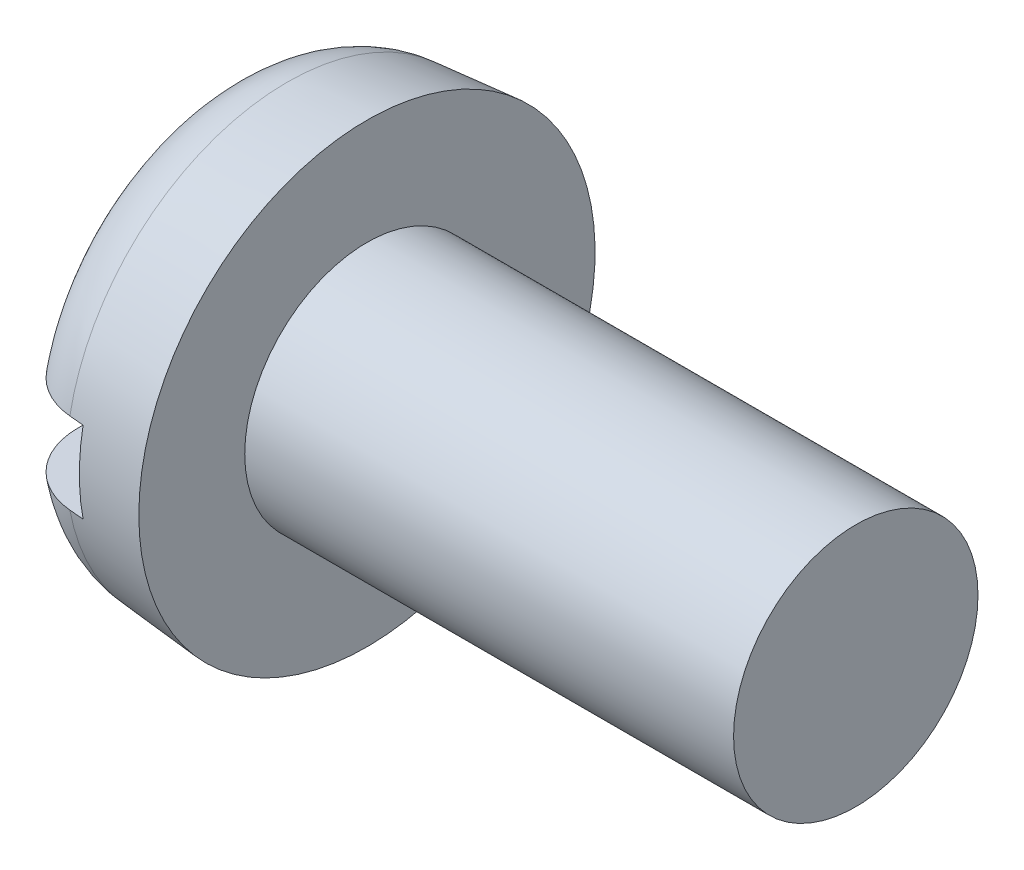
ISO-10303-21;
HEADER;
FILE_DESCRIPTION(('STEP AP214'),'2;1');
FILE_NAME('part.step','',(''),(''),'','','');
FILE_SCHEMA(('AUTOMOTIVE_DESIGN { 1 0 10303 214 1 1 1 1 }'));
ENDSEC;
DATA;
#1=APPLICATION_CONTEXT('core data for automotive mechanical design processes');
#2=APPLICATION_PROTOCOL_DEFINITION('international standard','automotive_design',2000,#1);
#3=PRODUCT_CONTEXT('',#1,'mechanical');
#4=PRODUCT('Part','Part','',(#3));
#5=PRODUCT_RELATED_PRODUCT_CATEGORY('part','',(#4));
#6=PRODUCT_DEFINITION_FORMATION('','',#4);
#7=PRODUCT_DEFINITION_CONTEXT('part definition',#1,'design');
#8=PRODUCT_DEFINITION('design','',#6,#7);
#9=PRODUCT_DEFINITION_SHAPE('','',#8);
#10=(LENGTH_UNIT() NAMED_UNIT(*) SI_UNIT(.MILLI.,.METRE.));
#11=(NAMED_UNIT(*) PLANE_ANGLE_UNIT() SI_UNIT($,.RADIAN.));
#12=(NAMED_UNIT(*) SI_UNIT($,.STERADIAN.) SOLID_ANGLE_UNIT());
#13=UNCERTAINTY_MEASURE_WITH_UNIT(LENGTH_MEASURE(1.E-05),#10,'distance_accuracy_value','');
#14=(GEOMETRIC_REPRESENTATION_CONTEXT(3) GLOBAL_UNCERTAINTY_ASSIGNED_CONTEXT((#13)) GLOBAL_UNIT_ASSIGNED_CONTEXT((#10,
#11,#12)) REPRESENTATION_CONTEXT('',''));
#15=CARTESIAN_POINT('',(0.,0.,0.));
#16=DIRECTION('',(0.,0.,1.));
#17=DIRECTION('',(1.,0.,0.));
#18=AXIS2_PLACEMENT_3D('',#15,#16,#17);
#19=CARTESIAN_POINT('',(0.821559831527111,0.,0.));
#20=DIRECTION('',(1.,0.,0.));
#21=DIRECTION('',(0.,0.,-1.));
#22=AXIS2_PLACEMENT_3D('',#19,#20,#21);
#23=CONICAL_SURFACE('',#22,2.71439757732023,0.0872664625997177);
#24=CARTESIAN_POINT('',(1.8,0.,0.));
#25=DIRECTION('',(-1.,0.,0.));
#26=DIRECTION('',(0.,0.,1.));
#27=AXIS2_PLACEMENT_3D('',#24,#25,#26);
#28=CIRCLE('',#27,2.8);
#29=CARTESIAN_POINT('',(1.8,0.,2.8));
#30=VERTEX_POINT('',#29);
#31=EDGE_CURVE('E104',#30,#30,#28,.T.);
#32=ORIENTED_EDGE('',*,*,#31,.T.);
#33=EDGE_LOOP('',(#32));
#34=FACE_BOUND('',#33,.T.);
#35=CARTESIAN_POINT('',(0.821559831527111,0.,0.));
#36=DIRECTION('',(-1.,0.,0.));
#37=DIRECTION('',(0.,0.,1.));
#38=AXIS2_PLACEMENT_3D('',#35,#36,#37);
#39=CIRCLE('',#38,2.71439757732023);
#40=CARTESIAN_POINT('',(0.821559831527131,-0.5,-2.6679494387568));
#41=VERTEX_POINT('',#40);
#42=CARTESIAN_POINT('',(0.821559831527111,-0.5,2.66794943875665));
#43=VERTEX_POINT('',#42);
#44=EDGE_CURVE('E111',#41,#43,#39,.T.);
#45=ORIENTED_EDGE('',*,*,#44,.F.);
#46=CARTESIAN_POINT('',(-4.12442087428723,-0.5,-2.22622217076508));
#47=CARTESIAN_POINT('',(-2.73083596809293,-0.5,-2.35116163400447));
#48=CARTESIAN_POINT('',(-1.33721073289136,-0.5,-2.47564974071432));
#49=CARTESIAN_POINT('',(0.322516888411918,-0.5,-2.62352009517032));
#50=CARTESIAN_POINT('',(0.588591528203756,-0.5,-2.64721365190135));
#51=CARTESIAN_POINT('',(2.51440730621907,-0.5,-2.81862532501024));
#52=CARTESIAN_POINT('',(4.17418519303496,-0.5,-2.96593083064264));
#53=CARTESIAN_POINT('',(5.83398131767659,-0.5,-3.11302949975196));
#54=B_SPLINE_CURVE_WITH_KNOTS('',3,(#46,#47,#48,#49,#50,#51,#52,#53),.UNSPECIFIED.,.F.,.F.,(4,2,
2,4),(0.,4.19752268049344,4.99890516464748,9.99781018983124),.UNSPECIFIED.);
#55=CARTESIAN_POINT('',(1.,-0.5,-2.68383112691559));
#56=VERTEX_POINT('',#55);
#57=EDGE_CURVE('E55',#41,#56,#54,.T.);
#58=ORIENTED_EDGE('',*,*,#57,.T.);
#59=CARTESIAN_POINT('',(1.,0.,0.));
#60=DIRECTION('',(1.,0.,0.));
#61=DIRECTION('',(0.,0.,-1.));
#62=AXIS2_PLACEMENT_3D('',#59,#60,#61);
#63=CIRCLE('',#62,2.73000906917926);
#64=CARTESIAN_POINT('',(1.,0.5,-2.68383112691559));
#65=VERTEX_POINT('',#64);
#66=EDGE_CURVE('E11',#65,#56,#63,.F.);
#67=ORIENTED_EDGE('',*,*,#66,.F.);
#68=CARTESIAN_POINT('',(-4.12442087428723,0.5,-2.22622217076508));
#69=CARTESIAN_POINT('',(-2.73083596809293,0.5,-2.35116163400447));
#70=CARTESIAN_POINT('',(-1.33721073289136,0.5,-2.47564974071432));
#71=CARTESIAN_POINT('',(0.322516888411918,0.5,-2.62352009517032));
#72=CARTESIAN_POINT('',(0.588591528203756,0.5,-2.64721365190135));
#73=CARTESIAN_POINT('',(2.51440730621907,0.5,-2.81862532501024));
#74=CARTESIAN_POINT('',(4.17418519303496,0.5,-2.96593083064264));
#75=CARTESIAN_POINT('',(5.83398131767659,0.5,-3.11302949975196));
#76=B_SPLINE_CURVE_WITH_KNOTS('',3,(#68,#69,#70,#71,#72,#73,#74,#75),.UNSPECIFIED.,.F.,.F.,(4,2,
2,4),(0.,4.19752268049344,4.99890516464748,9.99781018983124),.UNSPECIFIED.);
#77=CARTESIAN_POINT('',(0.821559831527131,0.5,-2.6679494387568));
#78=VERTEX_POINT('',#77);
#79=EDGE_CURVE('E144',#78,#65,#76,.T.);
#80=ORIENTED_EDGE('',*,*,#79,.F.);
#81=CARTESIAN_POINT('',(0.821559831527111,0.5,2.66794943875665));
#82=VERTEX_POINT('',#81);
#83=EDGE_CURVE('E100',#82,#78,#39,.T.);
#84=ORIENTED_EDGE('',*,*,#83,.F.);
#85=CARTESIAN_POINT('',(5.83398131767659,0.5,3.11302949975196));
#86=CARTESIAN_POINT('',(5.00408229964913,0.5,3.03949048597513));
#87=CARTESIAN_POINT('',(4.1741887401106,0.5,2.96588979968509));
#88=CARTESIAN_POINT('',(2.51441615810201,0.5,2.81852532777011));
#89=CARTESIAN_POINT('',(1.68453713563101,0.5,2.74476154215586));
#90=CARTESIAN_POINT('',(0.0247971144339573,0.5,2.59703110546268));
#91=CARTESIAN_POINT('',(-0.805063884291556,0.5,2.52306445437773));
#92=CARTESIAN_POINT('',(-2.46476188818933,0.5,2.37486187326903));
#93=CARTESIAN_POINT('',(-3.29459889336,0.5,2.30062594322747));
#94=CARTESIAN_POINT('',(-4.12442087428723,0.5,2.22622217076508));
#95=B_SPLINE_CURVE_WITH_KNOTS('',3,(#85,#86,#87,#88,#89,#90,#91,#92,#93,#94),.UNSPECIFIED.,.F.,
.F.,(4,2,2,2,4),(0.,2.49945260657952,4.99890504932049,7.49835756619491,9.99781024832811),.UNSPECIFIED.);
#96=CARTESIAN_POINT('',(1.,0.5,2.68383112691559));
#97=VERTEX_POINT('',#96);
#98=EDGE_CURVE('E47',#97,#82,#95,.T.);
#99=ORIENTED_EDGE('',*,*,#98,.F.);
#100=CARTESIAN_POINT('',(1.,-0.5,2.68383112691559));
#101=VERTEX_POINT('',#100);
#102=EDGE_CURVE('E36',#101,#97,#63,.F.);
#103=ORIENTED_EDGE('',*,*,#102,.F.);
#104=CARTESIAN_POINT('',(5.83398131767659,-0.5,3.11302949975196));
#105=CARTESIAN_POINT('',(5.00408229964913,-0.5,3.03949048597513));
#106=CARTESIAN_POINT('',(4.1741887401106,-0.5,2.96588979968509));
#107=CARTESIAN_POINT('',(2.51441615810201,-0.5,2.81852532777011));
#108=CARTESIAN_POINT('',(1.68453713563101,-0.5,2.74476154215586));
#109=CARTESIAN_POINT('',(0.0247971144339573,-0.5,2.59703110546268));
#110=CARTESIAN_POINT('',(-0.805063884291556,-0.5,2.52306445437773));
#111=CARTESIAN_POINT('',(-2.46476188818933,-0.5,2.37486187326903));
#112=CARTESIAN_POINT('',(-3.29459889336,-0.5,2.30062594322747));
#113=CARTESIAN_POINT('',(-4.12442087428723,-0.5,2.22622217076508));
#114=B_SPLINE_CURVE_WITH_KNOTS('',3,(#104,#105,#106,#107,#108,#109,#110,#111,#112,#113),
.UNSPECIFIED.,.F.,.F.,(4,2,2,2,4),(0.,2.49945260657952,4.99890504932049,7.49835756619491,
9.99781024832811),.UNSPECIFIED.);
#115=EDGE_CURVE('E151',#101,#43,#114,.T.);
#116=ORIENTED_EDGE('',*,*,#115,.T.);
#117=EDGE_LOOP('',(#45,#58,#67,#80,#84,#99,#103,#116));
#118=FACE_BOUND('',#117,.T.);
#119=ADVANCED_FACE('F32',(#34,#118),#23,.T.);
#120=CARTESIAN_POINT('',(0.,0.,0.));
#121=DIRECTION('',(-1.,0.,0.));
#122=DIRECTION('',(0.,0.,1.));
#123=AXIS2_PLACEMENT_3D('',#120,#121,#122);
#124=PLANE('',#123);
#125=CARTESIAN_POINT('',(0.,0.,0.));
#126=DIRECTION('',(-1.,0.,0.));
#127=DIRECTION('',(0.,0.,1.));
#128=AXIS2_PLACEMENT_3D('',#125,#126,#127);
#129=CIRCLE('',#128,1.81782234903766);
#130=CARTESIAN_POINT('',(0.,-0.5,-1.74770652360756));
#131=VERTEX_POINT('',#130);
#132=CARTESIAN_POINT('',(0.,-0.5,1.74770652360766));
#133=VERTEX_POINT('',#132);
#134=EDGE_CURVE('E105',#131,#133,#129,.T.);
#135=ORIENTED_EDGE('',*,*,#134,.T.);
#136=DIRECTION('',(0.,0.,1.));
#137=VECTOR('',#136,1.);
#138=CARTESIAN_POINT('',(0.,-0.5,-1.81782234903766));
#139=LINE('',#138,#137);
#140=EDGE_CURVE('E206',#131,#133,#139,.T.);
#141=ORIENTED_EDGE('',*,*,#140,.F.);
#142=EDGE_LOOP('',(#135,#141));
#143=FACE_BOUND('',#142,.T.);
#144=ADVANCED_FACE('F179',(#143),#124,.T.);
#145=CARTESIAN_POINT('',(0.9,0.,0.));
#146=DIRECTION('',(-1.,0.,0.));
#147=DIRECTION('',(0.,0.,1.));
#148=AXIS2_PLACEMENT_3D('',#145,#146,#147);
#149=TOROIDAL_SURFACE('',#148,1.81782234903766,0.9);
#150=ORIENTED_EDGE('',*,*,#134,.F.);
#151=CARTESIAN_POINT('',(0.334626026903701,-0.5,-2.46793360831049));
#152=CARTESIAN_POINT('',(0.373275648904086,-0.5,-2.49977130208659));
#153=CARTESIAN_POINT('',(0.414602352616745,-0.5,-2.52838421117688));
#154=CARTESIAN_POINT('',(0.501482653581103,-0.5,-2.57829292720234));
#155=CARTESIAN_POINT('',(0.547038320091168,-0.5,-2.59958512784551));
#156=CARTESIAN_POINT('',(0.641095951683961,-0.5,-2.63419701647043));
#157=CARTESIAN_POINT('',(0.689598385237159,-0.5,-2.64751543312539));
#158=CARTESIAN_POINT('',(0.788151814464883,-0.5,-2.66576358809586));
#159=CARTESIAN_POINT('',(0.838202640221332,-0.5,-2.67069424356938));
#160=CARTESIAN_POINT('',(0.938122790350139,-0.5,-2.67201489481239));
#161=CARTESIAN_POINT('',(0.987991462311356,-0.5,-2.66845471260746));
#162=CARTESIAN_POINT('',(1.08642068078859,-0.5,-2.65300579068591));
#163=CARTESIAN_POINT('',(1.13498123642244,-0.5,-2.64111710903621));
#164=CARTESIAN_POINT('',(1.22939259782638,-0.5,-2.6093811903211));
#165=CARTESIAN_POINT('',(1.27524506230553,-0.5,-2.58953888409779));
#166=CARTESIAN_POINT('',(1.36299979102268,-0.5,-2.54249087103575));
#167=CARTESIAN_POINT('',(1.40490198219518,-0.5,-2.51528502803477));
#168=CARTESIAN_POINT('',(1.48390827906179,-0.5,-2.45409196248148));
#169=CARTESIAN_POINT('',(1.52097536325995,-0.5,-2.42005696607452));
#170=CARTESIAN_POINT('',(1.58897450058502,-0.5,-2.34633281416614));
#171=CARTESIAN_POINT('',(1.61990622330414,-0.5,-2.30664335435241));
#172=CARTESIAN_POINT('',(1.67529968602995,-0.5,-2.22208664505847));
#173=CARTESIAN_POINT('',(1.6996521190693,-0.5,-2.17714783246274));
#174=CARTESIAN_POINT('',(1.74067416623053,-0.5,-2.08389516979523));
#175=CARTESIAN_POINT('',(1.75734303438384,-0.5,-2.03558099254607));
#176=CARTESIAN_POINT('',(1.78300298873171,-0.5,-1.93565537209906));
#177=CARTESIAN_POINT('',(1.79178952771252,-0.5,-1.88399147063275));
#178=CARTESIAN_POINT('',(1.80087955019692,-0.5,-1.77992679417679));
#179=CARTESIAN_POINT('',(1.80118168139773,-0.5,-1.72752590305235));
#180=CARTESIAN_POINT('',(1.79332687661337,-0.5,-1.62150229168849));
#181=CARTESIAN_POINT('',(1.78487071332093,-0.5,-1.56790180895203));
#182=CARTESIAN_POINT('',(1.75944402312706,-0.5,-1.46276517620418));
#183=CARTESIAN_POINT('',(1.74247216354575,-0.5,-1.41122935066878));
#184=CARTESIAN_POINT('',(1.69973001799174,-0.5,-1.30945300587343));
#185=CARTESIAN_POINT('',(1.67362852824404,-0.5,-1.25935148013265));
#186=CARTESIAN_POINT('',(1.61357159079207,-0.5,-1.16405892694269));
#187=CARTESIAN_POINT('',(1.57961116176646,-0.5,-1.11887104077686));
#188=CARTESIAN_POINT('',(1.50376329905658,-0.5,-1.0337112512591));
#189=CARTESIAN_POINT('',(1.46170411957052,-0.5,-0.993891803998863));
#190=CARTESIAN_POINT('',(1.37117703029393,-0.5,-0.922355348192727));
#191=CARTESIAN_POINT('',(1.32271533536457,-0.5,-0.890630568670401));
#192=CARTESIAN_POINT('',(1.2312046810326,-0.5,-0.842690969595324));
#193=CARTESIAN_POINT('',(1.18912546937037,-0.5,-0.824622784080812));
#194=CARTESIAN_POINT('',(1.10255861274784,-0.5,-0.795746649315501));
#195=CARTESIAN_POINT('',(1.0580739497846,-0.5,-0.784929923853792));
#196=CARTESIAN_POINT('',(0.967673998821343,-0.5,-0.77133828556953));
#197=CARTESIAN_POINT('',(0.921753341373889,-0.5,-0.768598465725972));
#198=CARTESIAN_POINT('',(0.830175370168714,-0.5,-0.771514809199295));
#199=CARTESIAN_POINT('',(0.784518094683075,-0.5,-0.777172163322448));
#200=CARTESIAN_POINT('',(0.697929857130244,-0.5,-0.795732365487629));
#201=CARTESIAN_POINT('',(0.656886976988524,-0.5,-0.808125586523618));
#202=CARTESIAN_POINT('',(0.577173146849336,-0.5,-0.839008986790702));
#203=CARTESIAN_POINT('',(0.538503116302415,-0.5,-0.857501511954047));
#204=CARTESIAN_POINT('',(0.460533080702894,-0.5,-0.901824293734246));
#205=CARTESIAN_POINT('',(0.421541782889522,-0.5,-0.928195541644686));
#206=CARTESIAN_POINT('',(0.347792925856961,-0.5,-0.986302994999605));
#207=CARTESIAN_POINT('',(0.313037391547055,-0.5,-1.01804174920804));
#208=CARTESIAN_POINT('',(0.243479646141384,-0.5,-1.09108875477486));
#209=CARTESIAN_POINT('',(0.209431960527425,-0.5,-1.13311808856621));
#210=CARTESIAN_POINT('',(0.148336369117296,-0.5,-1.2219977241085));
#211=CARTESIAN_POINT('',(0.121291240797289,-0.5,-1.26884992852459));
#212=CARTESIAN_POINT('',(0.0733587767475121,-0.5,-1.36947453336687));
#213=CARTESIAN_POINT('',(0.0529991909167098,-0.5,-1.42349983885821));
#214=CARTESIAN_POINT('',(0.0217806706073692,-0.5,-1.53423469167121));
#215=CARTESIAN_POINT('',(0.0109212949227816,-0.5,-1.59094411420892));
#216=CARTESIAN_POINT('',(-0.000680324341489833,-0.5,-1.70458275794277));
#217=CARTESIAN_POINT('',(-0.00156435311654909,-0.5,-1.76149736490422));
#218=CARTESIAN_POINT('',(0.00666921460971717,-0.5,-1.8746114299676));
#219=CARTESIAN_POINT('',(0.0157860229088503,-0.5,-1.93081094407548));
#220=CARTESIAN_POINT('',(0.0433527886832883,-0.5,-2.0384128726962));
#221=CARTESIAN_POINT('',(0.0614042634417451,-0.5,-2.08991750610009));
#222=CARTESIAN_POINT('',(0.106225018654683,-0.5,-2.18895619996254));
#223=CARTESIAN_POINT('',(0.132986525864045,-0.5,-2.2364937534783));
#224=CARTESIAN_POINT('',(0.187690670689828,-0.5,-2.31616353898221));
#225=CARTESIAN_POINT('',(0.214069785609247,-0.5,-2.34938052851721));
#226=CARTESIAN_POINT('',(0.271204082895664,-0.5,-2.41181052423278));
#227=CARTESIAN_POINT('',(0.301958818722134,-0.5,-2.44102393838941));
#228=CARTESIAN_POINT('',(0.334626026903701,-0.5,-2.46793360831049));
#229=B_SPLINE_CURVE_WITH_KNOTS('',3,(#151,#152,#153,#154,#155,#156,#157,#158,#159,#160,#161,
#162,#163,#164,#165,#166,#167,#168,#169,#170,#171,#172,#173,#174,#175,#176,#177,#178,#179,#180,
#181,#182,#183,#184,#185,#186,#187,#188,#189,#190,#191,#192,#193,#194,#195,#196,#197,#198,#199,
#200,#201,#202,#203,#204,#205,#206,#207,#208,#209,#210,#211,#212,#213,#214,#215,#216,#217,#218,
#219,#220,#221,#222,#223,#224,#225,#226,#227,#228),.UNSPECIFIED.,.T.,.F.,(4,2,2,2,2,2,2,2,2,2,2,
2,2,2,2,2,2,2,2,2,2,2,2,2,2,2,2,2,2,2,2,2,2,2,2,2,2,2,4),(0.,0.150073146732412,
0.300220116205011,0.450391018488457,0.600545499309663,0.74982108246734,0.899095624874882,
1.04827776744486,1.19746266879324,1.34773006839132,1.49800555814813,1.65064247079236,
1.80329419926387,1.95980138321463,2.11633351220655,2.27839576148222,2.44048338090795,
2.60919467169492,2.77801319301286,2.95091177341894,3.12364373927754,3.26045975797941,
3.39710989223543,3.53435288269838,3.6716153374989,3.79970208091242,3.92783814698728,
4.06851416099342,4.20925716363432,4.37083217035867,4.53247116593948,4.70483688203616,
4.87719459274841,5.04709934830923,5.2169907140229,5.37990813713711,5.54268056189257,
5.66953744876948,5.7963813989308),.UNSPECIFIED.);
#230=EDGE_CURVE('E195',#131,#41,#229,.T.);
#231=ORIENTED_EDGE('',*,*,#230,.T.);
#232=ORIENTED_EDGE('',*,*,#44,.T.);
#233=CARTESIAN_POINT('',(0.695761881797138,-0.5,0.797527849052158));
#234=CARTESIAN_POINT('',(0.73781333384874,-0.5,0.785965443795317));
#235=CARTESIAN_POINT('',(0.780830092945095,-0.5,0.777846393157726));
#236=CARTESIAN_POINT('',(0.867624970182326,-0.5,0.769116632051677));
#237=CARTESIAN_POINT('',(0.911402995349383,-0.5,0.768505011057419));
#238=CARTESIAN_POINT('',(0.998367386331298,-0.5,0.774836259550941));
#239=CARTESIAN_POINT('',(1.04155416404185,-0.5,0.781773567133159));
#240=CARTESIAN_POINT('',(1.12619698148315,-0.5,0.802657582389035));
#241=CARTESIAN_POINT('',(1.16765197468548,-0.5,0.816608463896431));
#242=CARTESIAN_POINT('',(1.2487772993255,-0.5,0.851032986716648));
#243=CARTESIAN_POINT('',(1.28839079814597,-0.5,0.871639252814936));
#244=CARTESIAN_POINT('',(1.3642158109992,-0.5,0.91834984762334));
#245=CARTESIAN_POINT('',(1.40042618433426,-0.5,0.944456010412648));
#246=CARTESIAN_POINT('',(1.47415344798094,-0.5,1.00568009841042));
#247=CARTESIAN_POINT('',(1.51103494611872,-0.5,1.0415643618778));
#248=CARTESIAN_POINT('',(1.57896848839971,-0.5,1.11848807208497));
#249=CARTESIAN_POINT('',(1.61001749168183,-0.5,1.15953018944387));
#250=CARTESIAN_POINT('',(1.66857474715472,-0.5,1.25032764741879));
#251=CARTESIAN_POINT('',(1.69536990541037,-0.5,1.30054537734181));
#252=CARTESIAN_POINT('',(1.74026833084286,-0.5,1.40473444523626));
#253=CARTESIAN_POINT('',(1.75837054500728,-0.5,1.4587062370467));
#254=CARTESIAN_POINT('',(1.78536712384459,-0.5,1.56958076375049));
#255=CARTESIAN_POINT('',(1.79415289443117,-0.5,1.62651012104794));
#256=CARTESIAN_POINT('',(1.80165605827819,-0.5,1.74103401619115));
#257=CARTESIAN_POINT('',(1.80037514023537,-0.5,1.79862844085268));
#258=CARTESIAN_POINT('',(1.78779666262416,-0.5,1.91060503473536));
#259=CARTESIAN_POINT('',(1.77686333607823,-0.5,1.96502801810785));
#260=CARTESIAN_POINT('',(1.7456222557847,-0.5,2.07111653593492));
#261=CARTESIAN_POINT('',(1.72531664905969,-0.5,2.12278269890549));
#262=CARTESIAN_POINT('',(1.67682820611129,-0.5,2.21965573667746));
#263=CARTESIAN_POINT('',(1.64899919485797,-0.5,2.2650398219442));
#264=CARTESIAN_POINT('',(1.58588988798268,-0.5,2.3502939816606));
#265=CARTESIAN_POINT('',(1.55061096298909,-0.5,2.390165068157));
#266=CARTESIAN_POINT('',(1.47479237069204,-0.5,2.46198398594914));
#267=CARTESIAN_POINT('',(1.43444725966653,-0.5,2.49413733666256));
#268=CARTESIAN_POINT('',(1.34884189557066,-0.5,2.55105217341873));
#269=CARTESIAN_POINT('',(1.30358223313984,-0.5,2.57581454638437));
#270=CARTESIAN_POINT('',(1.21039836188347,-0.5,2.61675696488751));
#271=CARTESIAN_POINT('',(1.16254402736379,-0.5,2.63309616067642));
#272=CARTESIAN_POINT('',(1.06475678121195,-0.5,2.65741537035073));
#273=CARTESIAN_POINT('',(1.01482401135433,-0.5,2.66539595342669));
#274=CARTESIAN_POINT('',(0.914844586329804,-0.5,2.67271373983095));
#275=CARTESIAN_POINT('',(0.864804319491045,-0.5,2.67213851235753));
#276=CARTESIAN_POINT('',(0.765535235130208,-0.5,2.66257605972729));
#277=CARTESIAN_POINT('',(0.716306396598705,-0.5,2.65358905271672));
#278=CARTESIAN_POINT('',(0.620155421664219,-0.5,2.62750280668606));
#279=CARTESIAN_POINT('',(0.573228849594445,-0.5,2.61041990216113));
#280=CARTESIAN_POINT('',(0.482887005980971,-0.5,2.56866222001781));
#281=CARTESIAN_POINT('',(0.439471776038166,-0.5,2.54398735246969));
#282=CARTESIAN_POINT('',(0.357098481555818,-0.5,2.48761345136412));
#283=CARTESIAN_POINT('',(0.318167950329371,-0.5,2.45587420734086));
#284=CARTESIAN_POINT('',(0.246098316731351,-0.5,2.3863929407266));
#285=CARTESIAN_POINT('',(0.212959491058588,-0.5,2.34865063150351));
#286=CARTESIAN_POINT('',(0.152890402271188,-0.5,2.26768100750256));
#287=CARTESIAN_POINT('',(0.126054624241496,-0.5,2.22438363750579));
#288=CARTESIAN_POINT('',(0.0798449976638117,-0.5,2.13397936701696));
#289=CARTESIAN_POINT('',(0.0604718141945122,-0.5,2.08687212743555));
#290=CARTESIAN_POINT('',(0.0292230605581626,-0.5,1.98901420270965));
#291=CARTESIAN_POINT('',(0.017534312540283,-0.5,1.93820392357391));
#292=CARTESIAN_POINT('',(0.00255513324705669,-0.5,1.83536425588533));
#293=CARTESIAN_POINT('',(-0.000734037465548531,-0.5,1.78333468553019));
#294=CARTESIAN_POINT('',(0.0010370634327739,-0.5,1.67766921750121));
#295=CARTESIAN_POINT('',(0.00638194385347503,-0.5,1.62403816473432));
#296=CARTESIAN_POINT('',(0.0256344990653406,-0.5,1.51834257802767));
#297=CARTESIAN_POINT('',(0.0395432868496452,-0.5,1.46627824862699));
#298=CARTESIAN_POINT('',(0.0761438693586416,-0.5,1.36294170833287));
#299=CARTESIAN_POINT('',(0.099169873239112,-0.5,1.31178783646753));
#300=CARTESIAN_POINT('',(0.153241438265485,-0.5,1.21387084507843));
#301=CARTESIAN_POINT('',(0.184292522118294,-0.5,1.16711077962595));
#302=CARTESIAN_POINT('',(0.254676869891252,-0.5,1.07792735315924));
#303=CARTESIAN_POINT('',(0.294235133972406,-0.5,1.03568120276964));
#304=CARTESIAN_POINT('',(0.38008225117084,-0.5,0.958725906333809));
#305=CARTESIAN_POINT('',(0.426362289377703,-0.5,0.924007035435211));
#306=CARTESIAN_POINT('',(0.509753246762668,-0.5,0.872889782282794));
#307=CARTESIAN_POINT('',(0.545424857916313,-0.5,0.854123355683078));
#308=CARTESIAN_POINT('',(0.619045756221319,-0.5,0.821773859571963));
#309=CARTESIAN_POINT('',(0.656993589566124,-0.5,0.808187521525312));
#310=CARTESIAN_POINT('',(0.695761881797138,-0.5,0.797527849052158));
#311=B_SPLINE_CURVE_WITH_KNOTS('',3,(#233,#234,#235,#236,#237,#238,#239,#240,#241,#242,#243,
#244,#245,#246,#247,#248,#249,#250,#251,#252,#253,#254,#255,#256,#257,#258,#259,#260,#261,#262,
#263,#264,#265,#266,#267,#268,#269,#270,#271,#272,#273,#274,#275,#276,#277,#278,#279,#280,#281,
#282,#283,#284,#285,#286,#287,#288,#289,#290,#291,#292,#293,#294,#295,#296,#297,#298,#299,#300,
#301,#302,#303,#304,#305,#306,#307,#308,#309,#310),.UNSPECIFIED.,.T.,.F.,(4,2,2,2,2,2,2,2,2,2,2,
2,2,2,2,2,2,2,2,2,2,2,2,2,2,2,2,2,2,2,2,2,2,2,2,2,2,2,4),(0.,0.130699420105768,
0.261382988398612,0.391970336701852,0.522635490733216,0.656084239625503,0.789577561009042,
0.943325755614514,1.09715388807325,1.26711867734695,1.43710404997135,1.60904972581368,
1.78096655821838,1.94666081700181,2.11231713700401,2.27123844707334,2.43013054437774,
2.58414890255061,2.73814877096699,2.88912114896077,3.04008324562633,3.1895013095358,
3.3389154986305,3.48802950088912,3.63714526952866,3.78713255803254,3.93712701022352,
4.08924385843726,4.24137426041967,4.39707844937152,4.55280600418579,4.71377244073828,
4.87475980142717,5.04229473012568,5.20994526159696,5.38274273193649,5.55531560877505,
5.67588689888493,5.79638198444979),.UNSPECIFIED.);
#312=EDGE_CURVE('E101',#43,#133,#311,.T.);
#313=ORIENTED_EDGE('',*,*,#312,.T.);
#314=EDGE_LOOP('',(#150,#231,#232,#313));
#315=FACE_BOUND('',#314,.T.);
#316=ADVANCED_FACE('F173',(#315),#149,.T.);
#317=CARTESIAN_POINT('',(1.8,2.8,0.));
#318=DIRECTION('',(1.,0.,0.));
#319=DIRECTION('',(0.,0.,-1.));
#320=AXIS2_PLACEMENT_3D('',#317,#318,#319);
#321=PLANE('',#320);
#322=ORIENTED_EDGE('',*,*,#31,.F.);
#323=EDGE_LOOP('',(#322));
#324=FACE_BOUND('',#323,.T.);
#325=CARTESIAN_POINT('',(1.8,0.,0.));
#326=DIRECTION('',(1.,0.,0.));
#327=DIRECTION('',(0.,0.,-1.));
#328=AXIS2_PLACEMENT_3D('',#325,#326,#327);
#329=CIRCLE('',#328,1.5);
#330=CARTESIAN_POINT('',(1.8,0.,-1.5));
#331=VERTEX_POINT('',#330);
#332=EDGE_CURVE('E163',#331,#331,#329,.T.);
#333=ORIENTED_EDGE('',*,*,#332,.F.);
#334=EDGE_LOOP('',(#333));
#335=FACE_BOUND('',#334,.T.);
#336=ADVANCED_FACE('F171',(#324,#335),#321,.T.);
#337=DIRECTION('',(0.,0.,1.));
#338=VECTOR('',#337,1.);
#339=CARTESIAN_POINT('',(0.,0.5,-1.81782234903766));
#340=LINE('',#339,#338);
#341=CARTESIAN_POINT('',(0.,0.5,-1.74770652360756));
#342=VERTEX_POINT('',#341);
#343=CARTESIAN_POINT('',(0.,0.5,1.74770652360766));
#344=VERTEX_POINT('',#343);
#345=EDGE_CURVE('E84',#342,#344,#340,.T.);
#346=ORIENTED_EDGE('',*,*,#345,.T.);
#347=EDGE_CURVE('E98',#344,#342,#129,.T.);
#348=ORIENTED_EDGE('',*,*,#347,.T.);
#349=EDGE_LOOP('',(#346,#348));
#350=FACE_BOUND('',#349,.T.);
#351=ADVANCED_FACE('F103',(#350),#124,.T.);
#352=CARTESIAN_POINT('',(0.334626026903701,0.5,-2.46793360831049));
#353=CARTESIAN_POINT('',(0.373275648904086,0.5,-2.49977130208659));
#354=CARTESIAN_POINT('',(0.414602352616745,0.5,-2.52838421117688));
#355=CARTESIAN_POINT('',(0.501482653581103,0.5,-2.57829292720234));
#356=CARTESIAN_POINT('',(0.547038320091168,0.5,-2.59958512784551));
#357=CARTESIAN_POINT('',(0.641095951683961,0.5,-2.63419701647043));
#358=CARTESIAN_POINT('',(0.689598385237159,0.5,-2.64751543312539));
#359=CARTESIAN_POINT('',(0.788151814464883,0.5,-2.66576358809586));
#360=CARTESIAN_POINT('',(0.838202640221332,0.5,-2.67069424356938));
#361=CARTESIAN_POINT('',(0.938122790350139,0.5,-2.67201489481239));
#362=CARTESIAN_POINT('',(0.987991462311356,0.5,-2.66845471260746));
#363=CARTESIAN_POINT('',(1.08642068078859,0.5,-2.65300579068591));
#364=CARTESIAN_POINT('',(1.13498123642244,0.5,-2.64111710903621));
#365=CARTESIAN_POINT('',(1.22939259782638,0.5,-2.6093811903211));
#366=CARTESIAN_POINT('',(1.27524506230553,0.5,-2.58953888409779));
#367=CARTESIAN_POINT('',(1.36299979102268,0.5,-2.54249087103575));
#368=CARTESIAN_POINT('',(1.40490198219518,0.5,-2.51528502803477));
#369=CARTESIAN_POINT('',(1.48390827906179,0.5,-2.45409196248148));
#370=CARTESIAN_POINT('',(1.52097536325995,0.5,-2.42005696607452));
#371=CARTESIAN_POINT('',(1.58897450058502,0.5,-2.34633281416614));
#372=CARTESIAN_POINT('',(1.61990622330414,0.5,-2.30664335435241));
#373=CARTESIAN_POINT('',(1.67529968602995,0.5,-2.22208664505847));
#374=CARTESIAN_POINT('',(1.6996521190693,0.5,-2.17714783246274));
#375=CARTESIAN_POINT('',(1.74067416623053,0.5,-2.08389516979523));
#376=CARTESIAN_POINT('',(1.75734303438384,0.5,-2.03558099254607));
#377=CARTESIAN_POINT('',(1.78300298873171,0.5,-1.93565537209906));
#378=CARTESIAN_POINT('',(1.79178952771252,0.5,-1.88399147063275));
#379=CARTESIAN_POINT('',(1.80087955019692,0.5,-1.77992679417679));
#380=CARTESIAN_POINT('',(1.80118168139773,0.5,-1.72752590305235));
#381=CARTESIAN_POINT('',(1.79332687661337,0.5,-1.62150229168849));
#382=CARTESIAN_POINT('',(1.78487071332093,0.5,-1.56790180895203));
#383=CARTESIAN_POINT('',(1.75944402312706,0.5,-1.46276517620418));
#384=CARTESIAN_POINT('',(1.74247216354575,0.5,-1.41122935066878));
#385=CARTESIAN_POINT('',(1.69973001799174,0.5,-1.30945300587343));
#386=CARTESIAN_POINT('',(1.67362852824404,0.5,-1.25935148013265));
#387=CARTESIAN_POINT('',(1.61357159079207,0.5,-1.16405892694269));
#388=CARTESIAN_POINT('',(1.57961116176646,0.5,-1.11887104077686));
#389=CARTESIAN_POINT('',(1.50376329905658,0.5,-1.0337112512591));
#390=CARTESIAN_POINT('',(1.46170411957052,0.5,-0.993891803998863));
#391=CARTESIAN_POINT('',(1.37117703029393,0.5,-0.922355348192727));
#392=CARTESIAN_POINT('',(1.32271533536457,0.5,-0.890630568670401));
#393=CARTESIAN_POINT('',(1.2312046810326,0.5,-0.842690969595324));
#394=CARTESIAN_POINT('',(1.18912546937037,0.5,-0.824622784080812));
#395=CARTESIAN_POINT('',(1.10255861274784,0.5,-0.795746649315501));
#396=CARTESIAN_POINT('',(1.0580739497846,0.5,-0.784929923853792));
#397=CARTESIAN_POINT('',(0.967673998821343,0.5,-0.77133828556953));
#398=CARTESIAN_POINT('',(0.921753341373889,0.5,-0.768598465725972));
#399=CARTESIAN_POINT('',(0.830175370168714,0.5,-0.771514809199295));
#400=CARTESIAN_POINT('',(0.784518094683075,0.5,-0.777172163322448));
#401=CARTESIAN_POINT('',(0.697929857130244,0.5,-0.795732365487629));
#402=CARTESIAN_POINT('',(0.656886976988524,0.5,-0.808125586523618));
#403=CARTESIAN_POINT('',(0.577173146849336,0.5,-0.839008986790702));
#404=CARTESIAN_POINT('',(0.538503116302415,0.5,-0.857501511954047));
#405=CARTESIAN_POINT('',(0.460533080702894,0.5,-0.901824293734246));
#406=CARTESIAN_POINT('',(0.421541782889522,0.5,-0.928195541644686));
#407=CARTESIAN_POINT('',(0.347792925856961,0.5,-0.986302994999605));
#408=CARTESIAN_POINT('',(0.313037391547055,0.5,-1.01804174920804));
#409=CARTESIAN_POINT('',(0.243479646141384,0.5,-1.09108875477486));
#410=CARTESIAN_POINT('',(0.209431960527425,0.5,-1.13311808856621));
#411=CARTESIAN_POINT('',(0.148336369117296,0.5,-1.2219977241085));
#412=CARTESIAN_POINT('',(0.121291240797289,0.5,-1.26884992852459));
#413=CARTESIAN_POINT('',(0.0733587767475121,0.5,-1.36947453336687));
#414=CARTESIAN_POINT('',(0.0529991909167098,0.5,-1.42349983885821));
#415=CARTESIAN_POINT('',(0.0217806706073692,0.5,-1.53423469167121));
#416=CARTESIAN_POINT('',(0.0109212949227816,0.5,-1.59094411420892));
#417=CARTESIAN_POINT('',(-0.000680324341489833,0.5,-1.70458275794277));
#418=CARTESIAN_POINT('',(-0.00156435311654909,0.5,-1.76149736490422));
#419=CARTESIAN_POINT('',(0.00666921460971717,0.5,-1.8746114299676));
#420=CARTESIAN_POINT('',(0.0157860229088503,0.5,-1.93081094407548));
#421=CARTESIAN_POINT('',(0.0433527886832883,0.5,-2.0384128726962));
#422=CARTESIAN_POINT('',(0.0614042634417451,0.5,-2.08991750610009));
#423=CARTESIAN_POINT('',(0.106225018654683,0.5,-2.18895619996254));
#424=CARTESIAN_POINT('',(0.132986525864045,0.5,-2.2364937534783));
#425=CARTESIAN_POINT('',(0.187690670689828,0.5,-2.31616353898221));
#426=CARTESIAN_POINT('',(0.214069785609247,0.5,-2.34938052851721));
#427=CARTESIAN_POINT('',(0.271204082895664,0.5,-2.41181052423278));
#428=CARTESIAN_POINT('',(0.301958818722134,0.5,-2.44102393838941));
#429=CARTESIAN_POINT('',(0.334626026903701,0.5,-2.46793360831049));
#430=B_SPLINE_CURVE_WITH_KNOTS('',3,(#352,#353,#354,#355,#356,#357,#358,#359,#360,#361,#362,
#363,#364,#365,#366,#367,#368,#369,#370,#371,#372,#373,#374,#375,#376,#377,#378,#379,#380,#381,
#382,#383,#384,#385,#386,#387,#388,#389,#390,#391,#392,#393,#394,#395,#396,#397,#398,#399,#400,
#401,#402,#403,#404,#405,#406,#407,#408,#409,#410,#411,#412,#413,#414,#415,#416,#417,#418,#419,
#420,#421,#422,#423,#424,#425,#426,#427,#428,#429),.UNSPECIFIED.,.T.,.F.,(4,2,2,2,2,2,2,2,2,2,2,
2,2,2,2,2,2,2,2,2,2,2,2,2,2,2,2,2,2,2,2,2,2,2,2,2,2,2,4),(0.,0.150073146732412,
0.300220116205011,0.450391018488457,0.600545499309663,0.74982108246734,0.899095624874882,
1.04827776744486,1.19746266879324,1.34773006839132,1.49800555814813,1.65064247079236,
1.80329419926387,1.95980138321463,2.11633351220655,2.27839576148222,2.44048338090795,
2.60919467169492,2.77801319301286,2.95091177341894,3.12364373927754,3.26045975797941,
3.39710989223543,3.53435288269838,3.6716153374989,3.79970208091242,3.92783814698728,
4.06851416099342,4.20925716363432,4.37083217035867,4.53247116593948,4.70483688203616,
4.87719459274841,5.04709934830923,5.2169907140229,5.37990813713711,5.54268056189257,
5.66953744876948,5.7963813989308),.UNSPECIFIED.);
#431=EDGE_CURVE('E87',#342,#78,#430,.T.);
#432=ORIENTED_EDGE('',*,*,#431,.F.);
#433=ORIENTED_EDGE('',*,*,#347,.F.);
#434=CARTESIAN_POINT('',(0.695761881797138,0.5,0.797527849052158));
#435=CARTESIAN_POINT('',(0.73781333384874,0.5,0.785965443795317));
#436=CARTESIAN_POINT('',(0.780830092945095,0.5,0.777846393157726));
#437=CARTESIAN_POINT('',(0.867624970182326,0.5,0.769116632051677));
#438=CARTESIAN_POINT('',(0.911402995349383,0.5,0.768505011057419));
#439=CARTESIAN_POINT('',(0.998367386331298,0.5,0.774836259550941));
#440=CARTESIAN_POINT('',(1.04155416404185,0.5,0.781773567133159));
#441=CARTESIAN_POINT('',(1.12619698148315,0.5,0.802657582389035));
#442=CARTESIAN_POINT('',(1.16765197468548,0.5,0.816608463896431));
#443=CARTESIAN_POINT('',(1.2487772993255,0.5,0.851032986716648));
#444=CARTESIAN_POINT('',(1.28839079814597,0.5,0.871639252814936));
#445=CARTESIAN_POINT('',(1.3642158109992,0.5,0.91834984762334));
#446=CARTESIAN_POINT('',(1.40042618433426,0.5,0.944456010412648));
#447=CARTESIAN_POINT('',(1.47415344798094,0.5,1.00568009841042));
#448=CARTESIAN_POINT('',(1.51103494611872,0.5,1.0415643618778));
#449=CARTESIAN_POINT('',(1.57896848839971,0.5,1.11848807208497));
#450=CARTESIAN_POINT('',(1.61001749168183,0.5,1.15953018944387));
#451=CARTESIAN_POINT('',(1.66857474715472,0.5,1.25032764741879));
#452=CARTESIAN_POINT('',(1.69536990541037,0.5,1.30054537734181));
#453=CARTESIAN_POINT('',(1.74026833084286,0.5,1.40473444523626));
#454=CARTESIAN_POINT('',(1.75837054500728,0.5,1.4587062370467));
#455=CARTESIAN_POINT('',(1.78536712384459,0.5,1.56958076375049));
#456=CARTESIAN_POINT('',(1.79415289443117,0.5,1.62651012104794));
#457=CARTESIAN_POINT('',(1.80165605827819,0.5,1.74103401619115));
#458=CARTESIAN_POINT('',(1.80037514023537,0.5,1.79862844085268));
#459=CARTESIAN_POINT('',(1.78779666262416,0.5,1.91060503473536));
#460=CARTESIAN_POINT('',(1.77686333607823,0.5,1.96502801810785));
#461=CARTESIAN_POINT('',(1.7456222557847,0.5,2.07111653593492));
#462=CARTESIAN_POINT('',(1.72531664905969,0.5,2.12278269890549));
#463=CARTESIAN_POINT('',(1.67682820611129,0.5,2.21965573667746));
#464=CARTESIAN_POINT('',(1.64899919485797,0.5,2.2650398219442));
#465=CARTESIAN_POINT('',(1.58588988798268,0.5,2.3502939816606));
#466=CARTESIAN_POINT('',(1.55061096298909,0.5,2.390165068157));
#467=CARTESIAN_POINT('',(1.47479237069204,0.5,2.46198398594914));
#468=CARTESIAN_POINT('',(1.43444725966653,0.5,2.49413733666256));
#469=CARTESIAN_POINT('',(1.34884189557066,0.5,2.55105217341873));
#470=CARTESIAN_POINT('',(1.30358223313984,0.5,2.57581454638437));
#471=CARTESIAN_POINT('',(1.21039836188347,0.5,2.61675696488751));
#472=CARTESIAN_POINT('',(1.16254402736379,0.5,2.63309616067642));
#473=CARTESIAN_POINT('',(1.06475678121195,0.5,2.65741537035073));
#474=CARTESIAN_POINT('',(1.01482401135433,0.5,2.66539595342669));
#475=CARTESIAN_POINT('',(0.914844586329804,0.5,2.67271373983095));
#476=CARTESIAN_POINT('',(0.864804319491045,0.5,2.67213851235753));
#477=CARTESIAN_POINT('',(0.765535235130208,0.5,2.66257605972729));
#478=CARTESIAN_POINT('',(0.716306396598705,0.5,2.65358905271672));
#479=CARTESIAN_POINT('',(0.620155421664219,0.5,2.62750280668606));
#480=CARTESIAN_POINT('',(0.573228849594445,0.5,2.61041990216113));
#481=CARTESIAN_POINT('',(0.482887005980971,0.5,2.56866222001781));
#482=CARTESIAN_POINT('',(0.439471776038166,0.5,2.54398735246969));
#483=CARTESIAN_POINT('',(0.357098481555818,0.5,2.48761345136412));
#484=CARTESIAN_POINT('',(0.318167950329371,0.5,2.45587420734086));
#485=CARTESIAN_POINT('',(0.246098316731351,0.5,2.3863929407266));
#486=CARTESIAN_POINT('',(0.212959491058588,0.5,2.34865063150351));
#487=CARTESIAN_POINT('',(0.152890402271188,0.5,2.26768100750256));
#488=CARTESIAN_POINT('',(0.126054624241496,0.5,2.22438363750579));
#489=CARTESIAN_POINT('',(0.0798449976638117,0.5,2.13397936701696));
#490=CARTESIAN_POINT('',(0.0604718141945122,0.5,2.08687212743555));
#491=CARTESIAN_POINT('',(0.0292230605581626,0.5,1.98901420270965));
#492=CARTESIAN_POINT('',(0.017534312540283,0.5,1.93820392357391));
#493=CARTESIAN_POINT('',(0.00255513324705669,0.5,1.83536425588533));
#494=CARTESIAN_POINT('',(-0.000734037465548531,0.5,1.78333468553019));
#495=CARTESIAN_POINT('',(0.0010370634327739,0.5,1.67766921750121));
#496=CARTESIAN_POINT('',(0.00638194385347503,0.5,1.62403816473432));
#497=CARTESIAN_POINT('',(0.0256344990653406,0.5,1.51834257802767));
#498=CARTESIAN_POINT('',(0.0395432868496452,0.5,1.46627824862699));
#499=CARTESIAN_POINT('',(0.0761438693586416,0.5,1.36294170833287));
#500=CARTESIAN_POINT('',(0.099169873239112,0.5,1.31178783646753));
#501=CARTESIAN_POINT('',(0.153241438265485,0.5,1.21387084507843));
#502=CARTESIAN_POINT('',(0.184292522118294,0.5,1.16711077962595));
#503=CARTESIAN_POINT('',(0.254676869891252,0.5,1.07792735315924));
#504=CARTESIAN_POINT('',(0.294235133972406,0.5,1.03568120276964));
#505=CARTESIAN_POINT('',(0.38008225117084,0.5,0.958725906333809));
#506=CARTESIAN_POINT('',(0.426362289377703,0.5,0.924007035435211));
#507=CARTESIAN_POINT('',(0.509753246762668,0.5,0.872889782282794));
#508=CARTESIAN_POINT('',(0.545424857916313,0.5,0.854123355683078));
#509=CARTESIAN_POINT('',(0.619045756221319,0.5,0.821773859571963));
#510=CARTESIAN_POINT('',(0.656993589566124,0.5,0.808187521525312));
#511=CARTESIAN_POINT('',(0.695761881797138,0.5,0.797527849052158));
#512=B_SPLINE_CURVE_WITH_KNOTS('',3,(#434,#435,#436,#437,#438,#439,#440,#441,#442,#443,#444,
#445,#446,#447,#448,#449,#450,#451,#452,#453,#454,#455,#456,#457,#458,#459,#460,#461,#462,#463,
#464,#465,#466,#467,#468,#469,#470,#471,#472,#473,#474,#475,#476,#477,#478,#479,#480,#481,#482,
#483,#484,#485,#486,#487,#488,#489,#490,#491,#492,#493,#494,#495,#496,#497,#498,#499,#500,#501,
#502,#503,#504,#505,#506,#507,#508,#509,#510,#511),.UNSPECIFIED.,.T.,.F.,(4,2,2,2,2,2,2,2,2,2,2,
2,2,2,2,2,2,2,2,2,2,2,2,2,2,2,2,2,2,2,2,2,2,2,2,2,2,2,4),(0.,0.130699420105768,
0.261382988398612,0.391970336701852,0.522635490733216,0.656084239625503,0.789577561009042,
0.943325755614514,1.09715388807325,1.26711867734695,1.43710404997135,1.60904972581368,
1.78096655821838,1.94666081700181,2.11231713700401,2.27123844707334,2.43013054437774,
2.58414890255061,2.73814877096699,2.88912114896077,3.04008324562633,3.1895013095358,
3.3389154986305,3.48802950088912,3.63714526952866,3.78713255803254,3.93712701022352,
4.08924385843726,4.24137426041967,4.39707844937152,4.55280600418579,4.71377244073828,
4.87475980142717,5.04229473012568,5.20994526159696,5.38274273193649,5.55531560877505,
5.67588689888493,5.79638198444979),.UNSPECIFIED.);
#513=EDGE_CURVE('E89',#82,#344,#512,.T.);
#514=ORIENTED_EDGE('',*,*,#513,.F.);
#515=ORIENTED_EDGE('',*,*,#83,.T.);
#516=EDGE_LOOP('',(#432,#433,#514,#515));
#517=FACE_BOUND('',#516,.T.);
#518=ADVANCED_FACE('F97',(#517),#149,.T.);
#519=CARTESIAN_POINT('',(7.8,0.,0.));
#520=DIRECTION('',(-1.,0.,0.));
#521=DIRECTION('',(0.,0.,1.));
#522=AXIS2_PLACEMENT_3D('',#519,#520,#521);
#523=CYLINDRICAL_SURFACE('',#522,1.5);
#524=CARTESIAN_POINT('',(7.8,0.,0.));
#525=DIRECTION('',(1.,0.,0.));
#526=DIRECTION('',(0.,0.,-1.));
#527=AXIS2_PLACEMENT_3D('',#524,#525,#526);
#528=CIRCLE('',#527,1.5);
#529=CARTESIAN_POINT('',(7.8,0.,-1.5));
#530=VERTEX_POINT('',#529);
#531=EDGE_CURVE('E164',#530,#530,#528,.T.);
#532=ORIENTED_EDGE('',*,*,#531,.F.);
#533=EDGE_LOOP('',(#532));
#534=FACE_BOUND('',#533,.T.);
#535=ORIENTED_EDGE('',*,*,#332,.T.);
#536=EDGE_LOOP('',(#535));
#537=FACE_BOUND('',#536,.T.);
#538=ADVANCED_FACE('F169',(#534,#537),#523,.T.);
#539=CARTESIAN_POINT('',(7.8,0.,0.));
#540=DIRECTION('',(1.,0.,0.));
#541=DIRECTION('',(0.,0.,-1.));
#542=AXIS2_PLACEMENT_3D('',#539,#540,#541);
#543=PLANE('',#542);
#544=ORIENTED_EDGE('',*,*,#531,.T.);
#545=EDGE_LOOP('',(#544));
#546=FACE_BOUND('',#545,.T.);
#547=ADVANCED_FACE('F213',(#546),#543,.T.);
#548=CARTESIAN_POINT('',(1.,-0.5,-2.73000906917926));
#549=DIRECTION('',(1.,0.,0.));
#550=DIRECTION('',(0.,0.,-1.));
#551=AXIS2_PLACEMENT_3D('',#548,#549,#550);
#552=PLANE('',#551);
#553=DIRECTION('',(0.,0.,-1.));
#554=VECTOR('',#553,1.);
#555=CARTESIAN_POINT('',(1.,-0.5,-2.73000906917926));
#556=LINE('',#555,#554);
#557=EDGE_CURVE('E145',#101,#56,#556,.T.);
#558=ORIENTED_EDGE('',*,*,#557,.F.);
#559=ORIENTED_EDGE('',*,*,#102,.T.);
#560=DIRECTION('',(0.,0.,-1.));
#561=VECTOR('',#560,1.);
#562=CARTESIAN_POINT('',(1.,0.5,-2.73000906917926));
#563=LINE('',#562,#561);
#564=EDGE_CURVE('E93',#97,#65,#563,.T.);
#565=ORIENTED_EDGE('',*,*,#564,.T.);
#566=ORIENTED_EDGE('',*,*,#66,.T.);
#567=EDGE_LOOP('',(#558,#559,#565,#566));
#568=FACE_BOUND('',#567,.T.);
#569=ADVANCED_FACE('F132',(#568),#552,.F.);
#570=CARTESIAN_POINT('',(0.9,-0.5,-1.81782234903766));
#571=DIRECTION('',(0.,1.,0.));
#572=DIRECTION('',(0.,0.,1.));
#573=AXIS2_PLACEMENT_3D('',#570,#571,#572);
#574=PLANE('',#573);
#575=ORIENTED_EDGE('',*,*,#230,.F.);
#576=ORIENTED_EDGE('',*,*,#140,.T.);
#577=ORIENTED_EDGE('',*,*,#312,.F.);
#578=ORIENTED_EDGE('',*,*,#115,.F.);
#579=ORIENTED_EDGE('',*,*,#557,.T.);
#580=ORIENTED_EDGE('',*,*,#57,.F.);
#581=EDGE_LOOP('',(#575,#576,#577,#578,#579,#580));
#582=FACE_BOUND('',#581,.T.);
#583=ADVANCED_FACE('F130',(#582),#574,.T.);
#584=CARTESIAN_POINT('',(0.9,0.5,-1.81782234903766));
#585=DIRECTION('',(0.,1.,0.));
#586=DIRECTION('',(0.,0.,1.));
#587=AXIS2_PLACEMENT_3D('',#584,#585,#586);
#588=PLANE('',#587);
#589=ORIENTED_EDGE('',*,*,#79,.T.);
#590=ORIENTED_EDGE('',*,*,#564,.F.);
#591=ORIENTED_EDGE('',*,*,#98,.T.);
#592=ORIENTED_EDGE('',*,*,#513,.T.);
#593=ORIENTED_EDGE('',*,*,#345,.F.);
#594=ORIENTED_EDGE('',*,*,#431,.T.);
#595=EDGE_LOOP('',(#589,#590,#591,#592,#593,#594));
#596=FACE_BOUND('',#595,.T.);
#597=ADVANCED_FACE('F86',(#596),#588,.F.);
#598=CLOSED_SHELL('',(#119,#144,#316,#336,#351,#518,#538,#547,#569,#583,#597));
#599=MANIFOLD_SOLID_BREP('B2',#598);
#600=ADVANCED_BREP_SHAPE_REPRESENTATION('',(#18,#599),#14);
#601=SHAPE_DEFINITION_REPRESENTATION(#9,#600);
ENDSEC;
END-ISO-10303-21;
